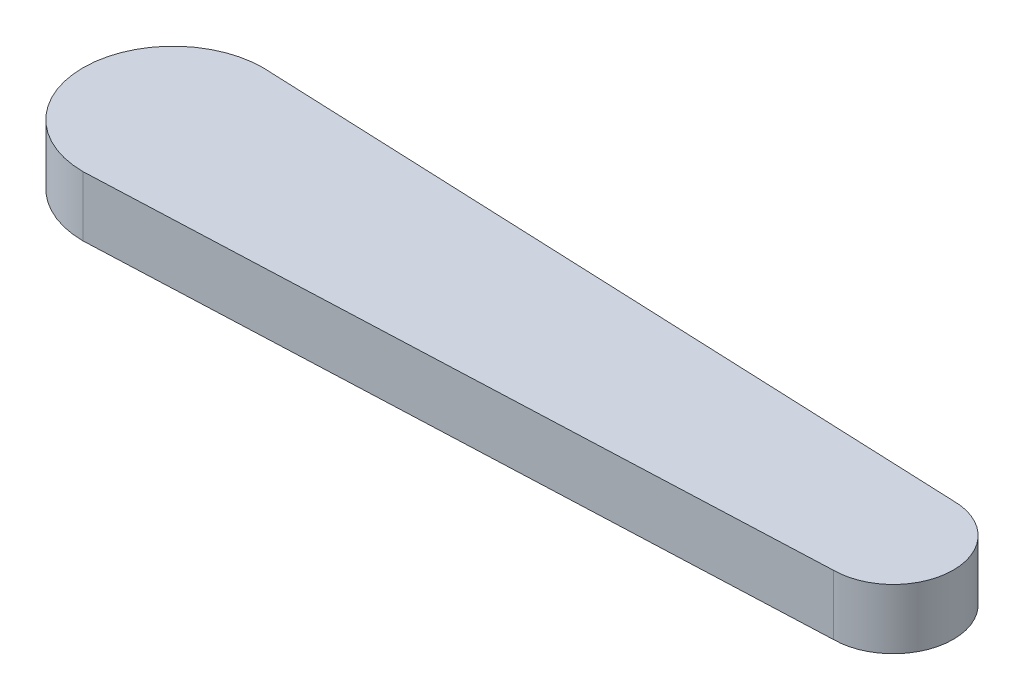
ISO-10303-21;
HEADER;
FILE_DESCRIPTION(('STEP AP214'),'2;1');
FILE_NAME('part.step','',(''),(''),'','','');
FILE_SCHEMA(('AUTOMOTIVE_DESIGN { 1 0 10303 214 1 1 1 1 }'));
ENDSEC;
DATA;
#1=APPLICATION_CONTEXT('core data for automotive mechanical design processes');
#2=APPLICATION_PROTOCOL_DEFINITION('international standard','automotive_design',2000,#1);
#3=PRODUCT_CONTEXT('',#1,'mechanical');
#4=PRODUCT('Part','Part','',(#3));
#5=PRODUCT_RELATED_PRODUCT_CATEGORY('part','',(#4));
#6=PRODUCT_DEFINITION_FORMATION('','',#4);
#7=PRODUCT_DEFINITION_CONTEXT('part definition',#1,'design');
#8=PRODUCT_DEFINITION('design','',#6,#7);
#9=PRODUCT_DEFINITION_SHAPE('','',#8);
#10=(LENGTH_UNIT() NAMED_UNIT(*) SI_UNIT(.MILLI.,.METRE.));
#11=(NAMED_UNIT(*) PLANE_ANGLE_UNIT() SI_UNIT($,.RADIAN.));
#12=(NAMED_UNIT(*) SI_UNIT($,.STERADIAN.) SOLID_ANGLE_UNIT());
#13=UNCERTAINTY_MEASURE_WITH_UNIT(LENGTH_MEASURE(1.E-05),#10,'distance_accuracy_value','');
#14=(GEOMETRIC_REPRESENTATION_CONTEXT(3) GLOBAL_UNCERTAINTY_ASSIGNED_CONTEXT((#13)) GLOBAL_UNIT_ASSIGNED_CONTEXT((#10,
#11,#12)) REPRESENTATION_CONTEXT('',''));
#15=CARTESIAN_POINT('',(0.,0.,0.));
#16=DIRECTION('',(0.,0.,1.));
#17=DIRECTION('',(1.,0.,0.));
#18=AXIS2_PLACEMENT_3D('',#15,#16,#17);
#19=CARTESIAN_POINT('',(0.517388842331611,10.,-12.4173322159587));
#20=DIRECTION('',(0.0416305447121813,0.,-0.999133073092352));
#21=DIRECTION('',(-0.999133073092352,0.,-0.0416305447121813));
#22=AXIS2_PLACEMENT_3D('',#19,#20,#21);
#23=PLANE('',#22);
#24=DIRECTION('',(0.999133073092352,0.,0.0416305447121813));
#25=VECTOR('',#24,1.);
#26=CARTESIAN_POINT('',(0.517388842331611,0.,-12.4173322159587));
#27=LINE('',#26,#25);
#28=CARTESIAN_POINT('',(-61.4666379746602,0.,-15.));
#29=VERTEX_POINT('',#28);
#30=CARTESIAN_POINT('',(58.5333620253398,0.,-10.));
#31=VERTEX_POINT('',#30);
#32=EDGE_CURVE('E135',#29,#31,#27,.T.);
#33=ORIENTED_EDGE('',*,*,#32,.F.);
#34=DIRECTION('',(0.,-1.,0.));
#35=VECTOR('',#34,1.);
#36=CARTESIAN_POINT('',(-61.4666379746602,10.,-15.));
#37=LINE('',#36,#35);
#38=CARTESIAN_POINT('',(-61.4666379746602,10.,-15.));
#39=VERTEX_POINT('',#38);
#40=EDGE_CURVE('E87',#39,#29,#37,.T.);
#41=ORIENTED_EDGE('',*,*,#40,.F.);
#42=DIRECTION('',(0.999133073092352,0.,0.0416305447121813));
#43=VECTOR('',#42,1.);
#44=CARTESIAN_POINT('',(0.517388842331611,10.,-12.4173322159587));
#45=LINE('',#44,#43);
#46=CARTESIAN_POINT('',(58.5333620253398,10.,-10.));
#47=VERTEX_POINT('',#46);
#48=EDGE_CURVE('E128',#39,#47,#45,.T.);
#49=ORIENTED_EDGE('',*,*,#48,.T.);
#50=DIRECTION('',(0.,-1.,0.));
#51=VECTOR('',#50,1.);
#52=CARTESIAN_POINT('',(58.5333620253398,10.,-10.));
#53=LINE('',#52,#51);
#54=EDGE_CURVE('E100',#47,#31,#53,.T.);
#55=ORIENTED_EDGE('',*,*,#54,.T.);
#56=EDGE_LOOP('',(#33,#41,#49,#55));
#57=FACE_BOUND('',#56,.T.);
#58=ADVANCED_FACE('F69',(#57),#23,.T.);
#59=CARTESIAN_POINT('',(0.517388842331611,10.,12.4173322159587));
#60=DIRECTION('',(0.0416305447121813,0.,0.999133073092352));
#61=DIRECTION('',(0.999133073092352,0.,-0.0416305447121813));
#62=AXIS2_PLACEMENT_3D('',#59,#60,#61);
#63=PLANE('',#62);
#64=DIRECTION('',(-0.999133073092352,0.,0.0416305447121813));
#65=VECTOR('',#64,1.);
#66=CARTESIAN_POINT('',(0.517388842331611,0.,12.4173322159587));
#67=LINE('',#66,#65);
#68=CARTESIAN_POINT('',(58.5333620253398,0.,10.));
#69=VERTEX_POINT('',#68);
#70=CARTESIAN_POINT('',(-61.4666379746602,0.,15.));
#71=VERTEX_POINT('',#70);
#72=EDGE_CURVE('E118',#69,#71,#67,.T.);
#73=ORIENTED_EDGE('',*,*,#72,.F.);
#74=DIRECTION('',(0.,-1.,0.));
#75=VECTOR('',#74,1.);
#76=CARTESIAN_POINT('',(58.5333620253398,10.,10.));
#77=LINE('',#76,#75);
#78=CARTESIAN_POINT('',(58.5333620253398,10.,10.));
#79=VERTEX_POINT('',#78);
#80=EDGE_CURVE('E79',#79,#69,#77,.T.);
#81=ORIENTED_EDGE('',*,*,#80,.F.);
#82=DIRECTION('',(-0.999133073092352,0.,0.0416305447121813));
#83=VECTOR('',#82,1.);
#84=CARTESIAN_POINT('',(0.517388842331611,10.,12.4173322159587));
#85=LINE('',#84,#83);
#86=CARTESIAN_POINT('',(-61.4666379746602,10.,15.));
#87=VERTEX_POINT('',#86);
#88=EDGE_CURVE('E116',#79,#87,#85,.T.);
#89=ORIENTED_EDGE('',*,*,#88,.T.);
#90=DIRECTION('',(0.,-1.,0.));
#91=VECTOR('',#90,1.);
#92=CARTESIAN_POINT('',(-61.4666379746602,10.,15.));
#93=LINE('',#92,#91);
#94=EDGE_CURVE('E12',#87,#71,#93,.T.);
#95=ORIENTED_EDGE('',*,*,#94,.T.);
#96=EDGE_LOOP('',(#73,#81,#89,#95));
#97=FACE_BOUND('',#96,.T.);
#98=ADVANCED_FACE('F114',(#97),#63,.T.);
#99=CARTESIAN_POINT('',(-61.4666379746602,10.,0.));
#100=DIRECTION('',(0.,-1.,0.));
#101=DIRECTION('',(0.,0.,-1.));
#102=AXIS2_PLACEMENT_3D('',#99,#100,#101);
#103=CYLINDRICAL_SURFACE('',#102,15.);
#104=CARTESIAN_POINT('',(-61.4666379746602,0.,0.));
#105=DIRECTION('',(0.,1.,0.));
#106=DIRECTION('',(0.,0.,1.));
#107=AXIS2_PLACEMENT_3D('',#104,#105,#106);
#108=CIRCLE('',#107,15.);
#109=EDGE_CURVE('E140',#29,#71,#108,.T.);
#110=ORIENTED_EDGE('',*,*,#109,.T.);
#111=ORIENTED_EDGE('',*,*,#94,.F.);
#112=CARTESIAN_POINT('',(-61.4666379746602,10.,0.));
#113=DIRECTION('',(0.,1.,0.));
#114=DIRECTION('',(0.,0.,1.));
#115=AXIS2_PLACEMENT_3D('',#112,#113,#114);
#116=CIRCLE('',#115,15.);
#117=EDGE_CURVE('E131',#39,#87,#116,.T.);
#118=ORIENTED_EDGE('',*,*,#117,.F.);
#119=ORIENTED_EDGE('',*,*,#40,.T.);
#120=EDGE_LOOP('',(#110,#111,#118,#119));
#121=FACE_BOUND('',#120,.T.);
#122=ADVANCED_FACE('F71',(#121),#103,.T.);
#123=CARTESIAN_POINT('',(0.,0.,0.));
#124=DIRECTION('',(0.,1.,0.));
#125=DIRECTION('',(0.,0.,1.));
#126=AXIS2_PLACEMENT_3D('',#123,#124,#125);
#127=PLANE('',#126);
#128=ORIENTED_EDGE('',*,*,#109,.F.);
#129=ORIENTED_EDGE('',*,*,#32,.T.);
#130=CARTESIAN_POINT('',(58.5333620253398,0.,0.));
#131=DIRECTION('',(0.,1.,0.));
#132=DIRECTION('',(0.,0.,1.));
#133=AXIS2_PLACEMENT_3D('',#130,#131,#132);
#134=CIRCLE('',#133,9.99999999999999);
#135=EDGE_CURVE('E145',#69,#31,#134,.T.);
#136=ORIENTED_EDGE('',*,*,#135,.F.);
#137=ORIENTED_EDGE('',*,*,#72,.T.);
#138=EDGE_LOOP('',(#128,#129,#136,#137));
#139=FACE_BOUND('',#138,.T.);
#140=ADVANCED_FACE('F155',(#139),#127,.F.);
#141=CARTESIAN_POINT('',(0.,10.,0.));
#142=DIRECTION('',(0.,1.,0.));
#143=DIRECTION('',(0.,0.,1.));
#144=AXIS2_PLACEMENT_3D('',#141,#142,#143);
#145=PLANE('',#144);
#146=ORIENTED_EDGE('',*,*,#117,.T.);
#147=ORIENTED_EDGE('',*,*,#88,.F.);
#148=CARTESIAN_POINT('',(58.5333620253398,10.,0.));
#149=DIRECTION('',(0.,1.,0.));
#150=DIRECTION('',(0.,0.,1.));
#151=AXIS2_PLACEMENT_3D('',#148,#149,#150);
#152=CIRCLE('',#151,9.99999999999999);
#153=EDGE_CURVE('E123',#79,#47,#152,.T.);
#154=ORIENTED_EDGE('',*,*,#153,.T.);
#155=ORIENTED_EDGE('',*,*,#48,.F.);
#156=EDGE_LOOP('',(#146,#147,#154,#155));
#157=FACE_BOUND('',#156,.T.);
#158=ADVANCED_FACE('F130',(#157),#145,.T.);
#159=CARTESIAN_POINT('',(58.5333620253398,10.,0.));
#160=DIRECTION('',(0.,-1.,0.));
#161=DIRECTION('',(0.,0.,-1.));
#162=AXIS2_PLACEMENT_3D('',#159,#160,#161);
#163=CYLINDRICAL_SURFACE('',#162,9.99999999999999);
#164=ORIENTED_EDGE('',*,*,#135,.T.);
#165=ORIENTED_EDGE('',*,*,#54,.F.);
#166=ORIENTED_EDGE('',*,*,#153,.F.);
#167=ORIENTED_EDGE('',*,*,#80,.T.);
#168=EDGE_LOOP('',(#164,#165,#166,#167));
#169=FACE_BOUND('',#168,.T.);
#170=ADVANCED_FACE('F124',(#169),#163,.T.);
#171=CLOSED_SHELL('',(#58,#98,#122,#140,#158,#170));
#172=MANIFOLD_SOLID_BREP('B2',#171);
#173=ADVANCED_BREP_SHAPE_REPRESENTATION('',(#18,#172),#14);
#174=SHAPE_DEFINITION_REPRESENTATION(#9,#173);
ENDSEC;
END-ISO-10303-21;
